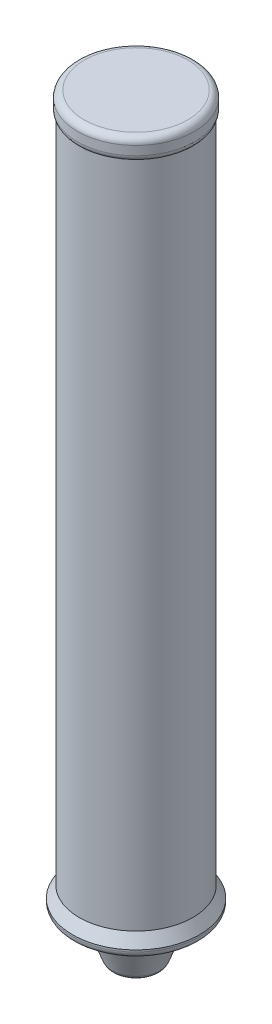
ISO-10303-21;
HEADER;
FILE_DESCRIPTION(('STEP AP214'),'2;1');
FILE_NAME('part.step','',(''),(''),'','','');
FILE_SCHEMA(('AUTOMOTIVE_DESIGN { 1 0 10303 214 1 1 1 1 }'));
ENDSEC;
DATA;
#1=APPLICATION_CONTEXT('core data for automotive mechanical design processes');
#2=APPLICATION_PROTOCOL_DEFINITION('international standard','automotive_design',2000,#1);
#3=PRODUCT_CONTEXT('',#1,'mechanical');
#4=PRODUCT('Part','Part','',(#3));
#5=PRODUCT_RELATED_PRODUCT_CATEGORY('part','',(#4));
#6=PRODUCT_DEFINITION_FORMATION('','',#4);
#7=PRODUCT_DEFINITION_CONTEXT('part definition',#1,'design');
#8=PRODUCT_DEFINITION('design','',#6,#7);
#9=PRODUCT_DEFINITION_SHAPE('','',#8);
#10=(LENGTH_UNIT() NAMED_UNIT(*) SI_UNIT(.MILLI.,.METRE.));
#11=(NAMED_UNIT(*) PLANE_ANGLE_UNIT() SI_UNIT($,.RADIAN.));
#12=(NAMED_UNIT(*) SI_UNIT($,.STERADIAN.) SOLID_ANGLE_UNIT());
#13=UNCERTAINTY_MEASURE_WITH_UNIT(LENGTH_MEASURE(1.E-05),#10,'distance_accuracy_value','');
#14=(GEOMETRIC_REPRESENTATION_CONTEXT(3) GLOBAL_UNCERTAINTY_ASSIGNED_CONTEXT((#13)) GLOBAL_UNIT_ASSIGNED_CONTEXT((#10,
#11,#12)) REPRESENTATION_CONTEXT('',''));
#15=CARTESIAN_POINT('',(0.,0.,0.));
#16=DIRECTION('',(0.,0.,1.));
#17=DIRECTION('',(1.,0.,0.));
#18=AXIS2_PLACEMENT_3D('',#15,#16,#17);
#19=CARTESIAN_POINT('',(0.,100.,0.));
#20=DIRECTION('',(0.,-1.,0.));
#21=DIRECTION('',(0.,0.,-1.));
#22=AXIS2_PLACEMENT_3D('',#19,#20,#21);
#23=CYLINDRICAL_SURFACE('',#22,8.5);
#24=CARTESIAN_POINT('',(0.,100.,0.));
#25=DIRECTION('',(0.,1.,0.));
#26=DIRECTION('',(0.,0.,1.));
#27=AXIS2_PLACEMENT_3D('',#24,#25,#26);
#28=CIRCLE('',#27,8.5);
#29=CARTESIAN_POINT('',(0.,100.,8.5));
#30=VERTEX_POINT('',#29);
#31=EDGE_CURVE('E140',#30,#30,#28,.T.);
#32=ORIENTED_EDGE('',*,*,#31,.F.);
#33=EDGE_LOOP('',(#32));
#34=FACE_BOUND('',#33,.T.);
#35=CARTESIAN_POINT('',(0.,0.,0.));
#36=DIRECTION('',(0.,1.,0.));
#37=DIRECTION('',(0.,0.,1.));
#38=AXIS2_PLACEMENT_3D('',#35,#36,#37);
#39=CIRCLE('',#38,8.5);
#40=CARTESIAN_POINT('',(0.,0.,8.5));
#41=VERTEX_POINT('',#40);
#42=EDGE_CURVE('E135',#41,#41,#39,.T.);
#43=ORIENTED_EDGE('',*,*,#42,.T.);
#44=EDGE_LOOP('',(#43));
#45=FACE_BOUND('',#44,.T.);
#46=ADVANCED_FACE('F48',(#34,#45),#23,.T.);
#47=CARTESIAN_POINT('',(0.,103.,0.));
#48=DIRECTION('',(0.,-1.,0.));
#49=DIRECTION('',(0.,0.,-1.));
#50=AXIS2_PLACEMENT_3D('',#47,#48,#49);
#51=CYLINDRICAL_SURFACE('',#50,8.75);
#52=CARTESIAN_POINT('',(0.,100.661437827766,0.));
#53=DIRECTION('',(0.,-1.,0.));
#54=DIRECTION('',(0.,0.,-1.));
#55=AXIS2_PLACEMENT_3D('',#52,#53,#54);
#56=CIRCLE('',#55,8.75);
#57=CARTESIAN_POINT('',(0.,100.661437827766,-8.75));
#58=VERTEX_POINT('',#57);
#59=EDGE_CURVE('E155',#58,#58,#56,.F.);
#60=ORIENTED_EDGE('',*,*,#59,.T.);
#61=EDGE_LOOP('',(#60));
#62=FACE_BOUND('',#61,.T.);
#63=CARTESIAN_POINT('',(0.,102.,0.));
#64=DIRECTION('',(0.,1.,0.));
#65=DIRECTION('',(0.,0.,1.));
#66=AXIS2_PLACEMENT_3D('',#63,#64,#65);
#67=CIRCLE('',#66,8.75);
#68=CARTESIAN_POINT('',(0.,102.,8.75));
#69=VERTEX_POINT('',#68);
#70=EDGE_CURVE('E151',#69,#69,#67,.F.);
#71=ORIENTED_EDGE('',*,*,#70,.T.);
#72=EDGE_LOOP('',(#71));
#73=FACE_BOUND('',#72,.T.);
#74=ADVANCED_FACE('F196',(#62,#73),#51,.T.);
#75=CARTESIAN_POINT('',(0.,103.,0.));
#76=DIRECTION('',(0.,1.,0.));
#77=DIRECTION('',(0.,0.,1.));
#78=AXIS2_PLACEMENT_3D('',#75,#76,#77);
#79=PLANE('',#78);
#80=CARTESIAN_POINT('',(0.,103.,0.));
#81=DIRECTION('',(0.,1.,0.));
#82=DIRECTION('',(0.,0.,1.));
#83=AXIS2_PLACEMENT_3D('',#80,#81,#82);
#84=CIRCLE('',#83,7.75);
#85=CARTESIAN_POINT('',(0.,103.,7.75));
#86=VERTEX_POINT('',#85);
#87=EDGE_CURVE('E144',#86,#86,#84,.T.);
#88=ORIENTED_EDGE('',*,*,#87,.T.);
#89=EDGE_LOOP('',(#88));
#90=FACE_BOUND('',#89,.T.);
#91=ADVANCED_FACE('F203',(#90),#79,.T.);
#92=CARTESIAN_POINT('',(0.,102.,0.));
#93=DIRECTION('',(0.,1.,0.));
#94=DIRECTION('',(0.,0.,1.));
#95=AXIS2_PLACEMENT_3D('',#92,#93,#94);
#96=TOROIDAL_SURFACE('',#95,7.75,1.);
#97=ORIENTED_EDGE('',*,*,#70,.F.);
#98=EDGE_LOOP('',(#97));
#99=FACE_BOUND('',#98,.T.);
#100=ORIENTED_EDGE('',*,*,#87,.F.);
#101=EDGE_LOOP('',(#100));
#102=FACE_BOUND('',#101,.T.);
#103=ADVANCED_FACE('F210',(#99,#102),#96,.T.);
#104=CARTESIAN_POINT('',(0.,100.661437827766,0.));
#105=DIRECTION('',(0.,-1.,0.));
#106=DIRECTION('',(0.,0.,-1.));
#107=AXIS2_PLACEMENT_3D('',#104,#105,#106);
#108=TOROIDAL_SURFACE('',#107,7.75,1.);
#109=ORIENTED_EDGE('',*,*,#31,.T.);
#110=EDGE_LOOP('',(#109));
#111=FACE_BOUND('',#110,.T.);
#112=ORIENTED_EDGE('',*,*,#59,.F.);
#113=EDGE_LOOP('',(#112));
#114=FACE_BOUND('',#113,.T.);
#115=ADVANCED_FACE('F213',(#111,#114),#108,.T.);
#116=CARTESIAN_POINT('',(0.,-3.,0.));
#117=DIRECTION('',(0.,1.,0.));
#118=DIRECTION('',(0.,0.,1.));
#119=AXIS2_PLACEMENT_3D('',#116,#117,#118);
#120=CYLINDRICAL_SURFACE('',#119,9.5);
#121=CARTESIAN_POINT('',(0.,-1.73205080756884,0.));
#122=DIRECTION('',(0.,-1.,0.));
#123=DIRECTION('',(0.,0.,-1.));
#124=AXIS2_PLACEMENT_3D('',#121,#122,#123);
#125=CIRCLE('',#124,9.5);
#126=CARTESIAN_POINT('',(0.,-1.73205080756884,-9.5));
#127=VERTEX_POINT('',#126);
#128=EDGE_CURVE('E167',#127,#127,#125,.T.);
#129=ORIENTED_EDGE('',*,*,#128,.T.);
#130=EDGE_LOOP('',(#129));
#131=FACE_BOUND('',#130,.T.);
#132=CARTESIAN_POINT('',(0.,-2.,0.));
#133=DIRECTION('',(0.,-1.,0.));
#134=DIRECTION('',(0.,0.,-1.));
#135=AXIS2_PLACEMENT_3D('',#132,#133,#134);
#136=CIRCLE('',#135,9.5);
#137=CARTESIAN_POINT('',(0.,-2.,-9.5));
#138=VERTEX_POINT('',#137);
#139=EDGE_CURVE('E163',#138,#138,#136,.F.);
#140=ORIENTED_EDGE('',*,*,#139,.T.);
#141=EDGE_LOOP('',(#140));
#142=FACE_BOUND('',#141,.T.);
#143=ADVANCED_FACE('F217',(#131,#142),#120,.T.);
#144=CARTESIAN_POINT('',(0.,-3.,0.));
#145=DIRECTION('',(0.,-1.,0.));
#146=DIRECTION('',(0.,0.,-1.));
#147=AXIS2_PLACEMENT_3D('',#144,#145,#146);
#148=PLANE('',#147);
#149=CARTESIAN_POINT('',(0.,-3.,0.));
#150=DIRECTION('',(0.,-1.,0.));
#151=DIRECTION('',(0.,0.,-1.));
#152=AXIS2_PLACEMENT_3D('',#149,#150,#151);
#153=CIRCLE('',#152,8.06184287580482);
#154=CARTESIAN_POINT('',(0.,-3.,-8.06184287580482));
#155=VERTEX_POINT('',#154);
#156=EDGE_CURVE('E175',#155,#155,#153,.F.);
#157=ORIENTED_EDGE('',*,*,#156,.T.);
#158=EDGE_LOOP('',(#157));
#159=FACE_BOUND('',#158,.T.);
#160=CARTESIAN_POINT('',(0.,-3.,0.));
#161=DIRECTION('',(0.,-1.,0.));
#162=DIRECTION('',(0.,0.,-1.));
#163=AXIS2_PLACEMENT_3D('',#160,#161,#162);
#164=CIRCLE('',#163,8.5);
#165=CARTESIAN_POINT('',(0.,-3.,-8.5));
#166=VERTEX_POINT('',#165);
#167=EDGE_CURVE('E159',#166,#166,#164,.T.);
#168=ORIENTED_EDGE('',*,*,#167,.T.);
#169=EDGE_LOOP('',(#168));
#170=FACE_BOUND('',#169,.T.);
#171=ADVANCED_FACE('F223',(#159,#170),#148,.T.);
#172=CARTESIAN_POINT('',(0.,-2.,0.));
#173=DIRECTION('',(0.,-1.,0.));
#174=DIRECTION('',(0.,0.,-1.));
#175=AXIS2_PLACEMENT_3D('',#172,#173,#174);
#176=TOROIDAL_SURFACE('',#175,8.5,1.);
#177=ORIENTED_EDGE('',*,*,#139,.F.);
#178=EDGE_LOOP('',(#177));
#179=FACE_BOUND('',#178,.T.);
#180=ORIENTED_EDGE('',*,*,#167,.F.);
#181=EDGE_LOOP('',(#180));
#182=FACE_BOUND('',#181,.T.);
#183=ADVANCED_FACE('F219',(#179,#182),#176,.T.);
#184=CARTESIAN_POINT('',(0.,-1.73205080756884,0.));
#185=DIRECTION('',(0.,-1.,0.));
#186=DIRECTION('',(0.,0.,-1.));
#187=AXIS2_PLACEMENT_3D('',#184,#185,#186);
#188=CONICAL_SURFACE('',#187,9.5,0.523598775598298);
#189=ORIENTED_EDGE('',*,*,#42,.F.);
#190=EDGE_LOOP('',(#189));
#191=FACE_BOUND('',#190,.T.);
#192=ORIENTED_EDGE('',*,*,#128,.F.);
#193=EDGE_LOOP('',(#192));
#194=FACE_BOUND('',#193,.T.);
#195=ADVANCED_FACE('F222',(#191,#194),#188,.T.);
#196=CARTESIAN_POINT('',(0.,-10.,0.));
#197=DIRECTION('',(0.,-1.,0.));
#198=DIRECTION('',(0.,0.,-1.));
#199=AXIS2_PLACEMENT_3D('',#196,#197,#198);
#200=PLANE('',#199);
#201=CARTESIAN_POINT('',(0.,-10.,0.));
#202=DIRECTION('',(0.,-1.,0.));
#203=DIRECTION('',(0.,0.,-1.));
#204=AXIS2_PLACEMENT_3D('',#201,#202,#203);
#205=CIRCLE('',#204,2.62567079615047);
#206=CARTESIAN_POINT('',(0.,-10.,-2.62567079615047));
#207=VERTEX_POINT('',#206);
#208=EDGE_CURVE('E57',#207,#207,#205,.T.);
#209=ORIENTED_EDGE('',*,*,#208,.T.);
#210=EDGE_LOOP('',(#209));
#211=FACE_BOUND('',#210,.T.);
#212=CARTESIAN_POINT('',(0.,-10.,0.));
#213=DIRECTION('',(0.,-1.,0.));
#214=DIRECTION('',(0.,0.,-1.));
#215=AXIS2_PLACEMENT_3D('',#212,#213,#214);
#216=CIRCLE('',#215,2.15);
#217=CARTESIAN_POINT('',(1.65,-10.,1.37840487520902));
#218=VERTEX_POINT('',#217);
#219=CARTESIAN_POINT('',(-1.65,-10.,1.37840487520902));
#220=VERTEX_POINT('',#219);
#221=EDGE_CURVE('E64',#218,#220,#216,.T.);
#222=ORIENTED_EDGE('',*,*,#221,.F.);
#223=DIRECTION('',(0.,0.,1.));
#224=VECTOR('',#223,1.);
#225=CARTESIAN_POINT('',(1.65,-10.,1.37840487520902));
#226=LINE('',#225,#224);
#227=CARTESIAN_POINT('',(1.65,-10.,-1.37840487520902));
#228=VERTEX_POINT('',#227);
#229=EDGE_CURVE('E119',#228,#218,#226,.T.);
#230=ORIENTED_EDGE('',*,*,#229,.F.);
#231=CARTESIAN_POINT('',(0.,-10.,0.));
#232=DIRECTION('',(0.,-1.,0.));
#233=DIRECTION('',(0.,0.,-1.));
#234=AXIS2_PLACEMENT_3D('',#231,#232,#233);
#235=CIRCLE('',#234,2.15);
#236=CARTESIAN_POINT('',(-1.65,-10.,-1.37840487520902));
#237=VERTEX_POINT('',#236);
#238=EDGE_CURVE('E128',#237,#228,#235,.T.);
#239=ORIENTED_EDGE('',*,*,#238,.F.);
#240=DIRECTION('',(0.,0.,-1.));
#241=VECTOR('',#240,1.);
#242=CARTESIAN_POINT('',(-1.65,-10.,1.37840487520902));
#243=LINE('',#242,#241);
#244=EDGE_CURVE('E99',#220,#237,#243,.T.);
#245=ORIENTED_EDGE('',*,*,#244,.F.);
#246=EDGE_LOOP('',(#222,#230,#239,#245));
#247=FACE_BOUND('',#246,.T.);
#248=ADVANCED_FACE('F182',(#211,#247),#200,.T.);
#249=CARTESIAN_POINT('',(0.,-3.,0.));
#250=DIRECTION('',(0.,-1.,0.));
#251=DIRECTION('',(0.,0.,-1.));
#252=AXIS2_PLACEMENT_3D('',#249,#250,#251);
#253=CYLINDRICAL_SURFACE('',#252,2.15);
#254=ORIENTED_EDGE('',*,*,#221,.T.);
#255=DIRECTION('',(0.,-1.,0.));
#256=VECTOR('',#255,1.);
#257=CARTESIAN_POINT('',(-1.65,-3.,1.37840487520902));
#258=LINE('',#257,#256);
#259=CARTESIAN_POINT('',(-1.65,-3.,1.37840487520902));
#260=VERTEX_POINT('',#259);
#261=EDGE_CURVE('E87',#260,#220,#258,.T.);
#262=ORIENTED_EDGE('',*,*,#261,.F.);
#263=CARTESIAN_POINT('',(0.,-3.,0.));
#264=DIRECTION('',(0.,-1.,0.));
#265=DIRECTION('',(0.,0.,-1.));
#266=AXIS2_PLACEMENT_3D('',#263,#264,#265);
#267=CIRCLE('',#266,2.15);
#268=CARTESIAN_POINT('',(1.65,-3.,1.37840487520902));
#269=VERTEX_POINT('',#268);
#270=EDGE_CURVE('E115',#269,#260,#267,.T.);
#271=ORIENTED_EDGE('',*,*,#270,.F.);
#272=DIRECTION('',(0.,-1.,0.));
#273=VECTOR('',#272,1.);
#274=CARTESIAN_POINT('',(1.65,-3.,1.37840487520902));
#275=LINE('',#274,#273);
#276=EDGE_CURVE('E72',#269,#218,#275,.T.);
#277=ORIENTED_EDGE('',*,*,#276,.T.);
#278=EDGE_LOOP('',(#254,#262,#271,#277));
#279=FACE_BOUND('',#278,.T.);
#280=ADVANCED_FACE('F252',(#279),#253,.F.);
#281=CARTESIAN_POINT('',(1.65,-3.,1.37840487520902));
#282=DIRECTION('',(1.,0.,0.));
#283=DIRECTION('',(0.,0.,-1.));
#284=AXIS2_PLACEMENT_3D('',#281,#282,#283);
#285=PLANE('',#284);
#286=ORIENTED_EDGE('',*,*,#229,.T.);
#287=ORIENTED_EDGE('',*,*,#276,.F.);
#288=DIRECTION('',(0.,0.,1.));
#289=VECTOR('',#288,1.);
#290=CARTESIAN_POINT('',(1.65,-3.,1.37840487520902));
#291=LINE('',#290,#289);
#292=CARTESIAN_POINT('',(1.65,-3.,-1.37840487520902));
#293=VERTEX_POINT('',#292);
#294=EDGE_CURVE('E112',#293,#269,#291,.T.);
#295=ORIENTED_EDGE('',*,*,#294,.F.);
#296=DIRECTION('',(0.,-1.,0.));
#297=VECTOR('',#296,1.);
#298=CARTESIAN_POINT('',(1.65,-3.,-1.37840487520902));
#299=LINE('',#298,#297);
#300=EDGE_CURVE('E104',#293,#228,#299,.T.);
#301=ORIENTED_EDGE('',*,*,#300,.T.);
#302=EDGE_LOOP('',(#286,#287,#295,#301));
#303=FACE_BOUND('',#302,.T.);
#304=ADVANCED_FACE('F249',(#303),#285,.F.);
#305=CARTESIAN_POINT('',(0.,-3.,0.));
#306=DIRECTION('',(0.,-1.,0.));
#307=DIRECTION('',(0.,0.,-1.));
#308=AXIS2_PLACEMENT_3D('',#305,#306,#307);
#309=CYLINDRICAL_SURFACE('',#308,2.15);
#310=ORIENTED_EDGE('',*,*,#238,.T.);
#311=ORIENTED_EDGE('',*,*,#300,.F.);
#312=CARTESIAN_POINT('',(0.,-3.,0.));
#313=DIRECTION('',(0.,-1.,0.));
#314=DIRECTION('',(0.,0.,-1.));
#315=AXIS2_PLACEMENT_3D('',#312,#313,#314);
#316=CIRCLE('',#315,2.15);
#317=CARTESIAN_POINT('',(-1.65,-3.,-1.37840487520902));
#318=VERTEX_POINT('',#317);
#319=EDGE_CURVE('E107',#318,#293,#316,.T.);
#320=ORIENTED_EDGE('',*,*,#319,.F.);
#321=DIRECTION('',(0.,-1.,0.));
#322=VECTOR('',#321,1.);
#323=CARTESIAN_POINT('',(-1.65,-3.,-1.37840487520902));
#324=LINE('',#323,#322);
#325=EDGE_CURVE('E92',#318,#237,#324,.T.);
#326=ORIENTED_EDGE('',*,*,#325,.T.);
#327=EDGE_LOOP('',(#310,#311,#320,#326));
#328=FACE_BOUND('',#327,.T.);
#329=ADVANCED_FACE('F108',(#328),#309,.F.);
#330=CARTESIAN_POINT('',(-1.65,-3.,1.37840487520902));
#331=DIRECTION('',(-1.,0.,0.));
#332=DIRECTION('',(0.,0.,1.));
#333=AXIS2_PLACEMENT_3D('',#330,#331,#332);
#334=PLANE('',#333);
#335=ORIENTED_EDGE('',*,*,#244,.T.);
#336=ORIENTED_EDGE('',*,*,#325,.F.);
#337=DIRECTION('',(0.,0.,-1.));
#338=VECTOR('',#337,1.);
#339=CARTESIAN_POINT('',(-1.65,-3.,1.37840487520902));
#340=LINE('',#339,#338);
#341=EDGE_CURVE('E96',#260,#318,#340,.T.);
#342=ORIENTED_EDGE('',*,*,#341,.F.);
#343=ORIENTED_EDGE('',*,*,#261,.T.);
#344=EDGE_LOOP('',(#335,#336,#342,#343));
#345=FACE_BOUND('',#344,.T.);
#346=ADVANCED_FACE('F94',(#345),#334,.F.);
#347=CARTESIAN_POINT('',(0.,-3.,0.));
#348=DIRECTION('',(0.,-1.,0.));
#349=DIRECTION('',(0.,0.,-1.));
#350=AXIS2_PLACEMENT_3D('',#347,#348,#349);
#351=PLANE('',#350);
#352=ORIENTED_EDGE('',*,*,#270,.T.);
#353=ORIENTED_EDGE('',*,*,#341,.T.);
#354=ORIENTED_EDGE('',*,*,#319,.T.);
#355=ORIENTED_EDGE('',*,*,#294,.T.);
#356=EDGE_LOOP('',(#352,#353,#354,#355));
#357=FACE_BOUND('',#356,.T.);
#358=ADVANCED_FACE('F114',(#357),#351,.T.);
#359=CARTESIAN_POINT('',(0.,-10.,0.));
#360=DIRECTION('',(0.,1.,0.));
#361=DIRECTION('',(0.,0.,1.));
#362=AXIS2_PLACEMENT_3D('',#359,#360,#361);
#363=CONICAL_SURFACE('',#362,3.31295175475209,0.366519142918807);
#364=CARTESIAN_POINT('',(0.,-9.3583679495453,0.));
#365=DIRECTION('',(0.,-1.,0.));
#366=DIRECTION('',(0.,0.,-1.));
#367=AXIS2_PLACEMENT_3D('',#364,#365,#366);
#368=CIRCLE('',#367,3.55925122264767);
#369=CARTESIAN_POINT('',(0.,-9.3583679495453,-3.55925122264767));
#370=VERTEX_POINT('',#369);
#371=EDGE_CURVE('E11',#370,#370,#368,.F.);
#372=ORIENTED_EDGE('',*,*,#371,.T.);
#373=EDGE_LOOP('',(#372));
#374=FACE_BOUND('',#373,.T.);
#375=CARTESIAN_POINT('',(0.,-4.92489615136411,0.));
#376=DIRECTION('',(0.,1.,0.));
#377=DIRECTION('',(0.,0.,1.));
#378=AXIS2_PLACEMENT_3D('',#375,#376,#377);
#379=CIRCLE('',#378,5.26110159631322);
#380=CARTESIAN_POINT('',(0.,-4.92489615136411,5.26110159631322));
#381=VERTEX_POINT('',#380);
#382=EDGE_CURVE('E171',#381,#381,#379,.F.);
#383=ORIENTED_EDGE('',*,*,#382,.T.);
#384=EDGE_LOOP('',(#383));
#385=FACE_BOUND('',#384,.T.);
#386=ADVANCED_FACE('F192',(#374,#385),#363,.T.);
#387=CARTESIAN_POINT('',(0.,-6.,0.));
#388=DIRECTION('',(0.,-1.,0.));
#389=DIRECTION('',(0.,0.,-1.));
#390=AXIS2_PLACEMENT_3D('',#387,#388,#389);
#391=TOROIDAL_SURFACE('',#390,8.06184287580482,3.);
#392=ORIENTED_EDGE('',*,*,#156,.F.);
#393=EDGE_LOOP('',(#392));
#394=FACE_BOUND('',#393,.T.);
#395=ORIENTED_EDGE('',*,*,#382,.F.);
#396=EDGE_LOOP('',(#395));
#397=FACE_BOUND('',#396,.T.);
#398=ADVANCED_FACE('F186',(#394,#397),#391,.F.);
#399=CARTESIAN_POINT('',(0.,-9.,0.));
#400=DIRECTION('',(0.,-1.,0.));
#401=DIRECTION('',(0.,0.,-1.));
#402=AXIS2_PLACEMENT_3D('',#399,#400,#401);
#403=TOROIDAL_SURFACE('',#402,2.62567079615047,1.);
#404=ORIENTED_EDGE('',*,*,#371,.F.);
#405=EDGE_LOOP('',(#404));
#406=FACE_BOUND('',#405,.T.);
#407=ORIENTED_EDGE('',*,*,#208,.F.);
#408=EDGE_LOOP('',(#407));
#409=FACE_BOUND('',#408,.T.);
#410=ADVANCED_FACE('F50',(#406,#409),#403,.T.);
#411=CLOSED_SHELL('',(#46,#74,#91,#103,#115,#143,#171,#183,#195,#248,#280,#304,#329,#346,#358,
#386,#398,#410));
#412=MANIFOLD_SOLID_BREP('B2',#411);
#413=ADVANCED_BREP_SHAPE_REPRESENTATION('',(#18,#412),#14);
#414=SHAPE_DEFINITION_REPRESENTATION(#9,#413);
ENDSEC;
END-ISO-10303-21;
